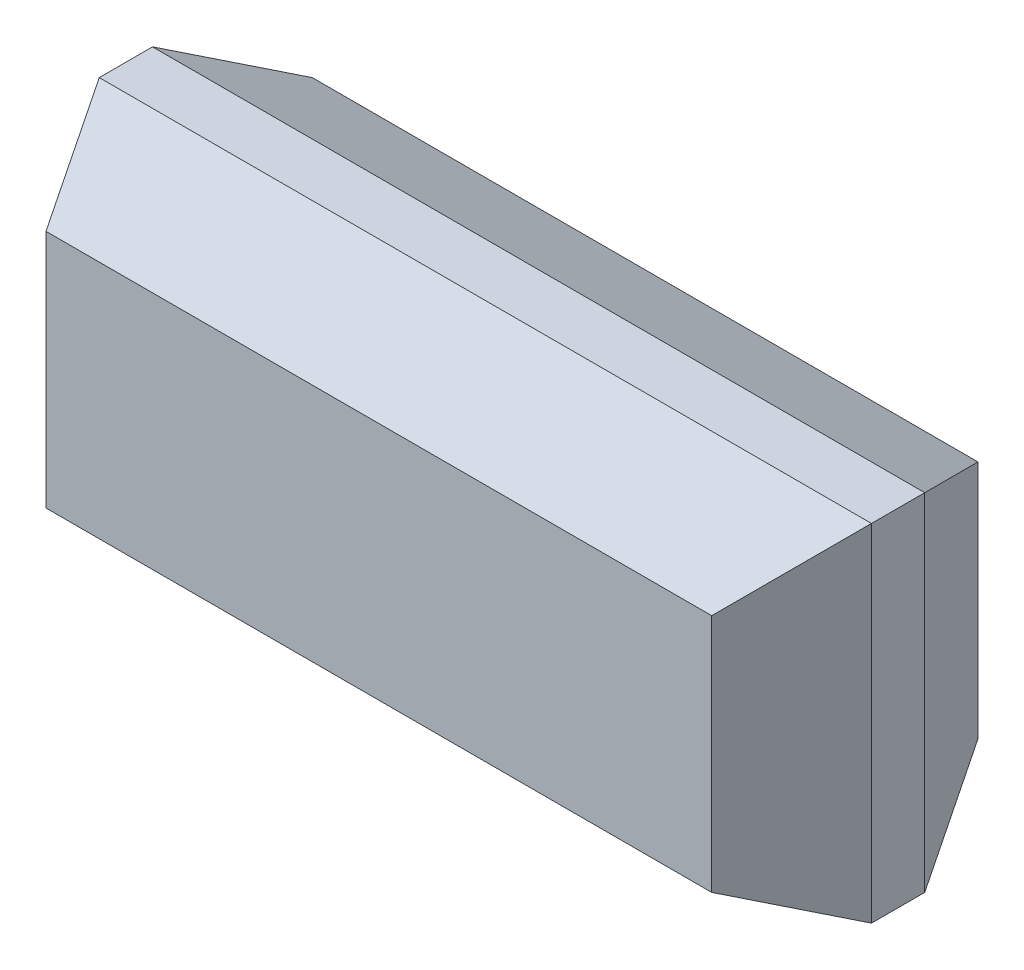
ISO-10303-21;
HEADER;
FILE_DESCRIPTION(('STEP AP214'),'2;1');
FILE_NAME('part.step','',(''),(''),'','','');
FILE_SCHEMA(('AUTOMOTIVE_DESIGN { 1 0 10303 214 1 1 1 1 }'));
ENDSEC;
DATA;
#1=APPLICATION_CONTEXT('core data for automotive mechanical design processes');
#2=APPLICATION_PROTOCOL_DEFINITION('international standard','automotive_design',2000,#1);
#3=PRODUCT_CONTEXT('',#1,'mechanical');
#4=PRODUCT('Part','Part','',(#3));
#5=PRODUCT_RELATED_PRODUCT_CATEGORY('part','',(#4));
#6=PRODUCT_DEFINITION_FORMATION('','',#4);
#7=PRODUCT_DEFINITION_CONTEXT('part definition',#1,'design');
#8=PRODUCT_DEFINITION('design','',#6,#7);
#9=PRODUCT_DEFINITION_SHAPE('','',#8);
#10=(LENGTH_UNIT() NAMED_UNIT(*) SI_UNIT(.MILLI.,.METRE.));
#11=(NAMED_UNIT(*) PLANE_ANGLE_UNIT() SI_UNIT($,.RADIAN.));
#12=(NAMED_UNIT(*) SI_UNIT($,.STERADIAN.) SOLID_ANGLE_UNIT());
#13=UNCERTAINTY_MEASURE_WITH_UNIT(LENGTH_MEASURE(1.E-05),#10,'distance_accuracy_value','');
#14=(GEOMETRIC_REPRESENTATION_CONTEXT(3) GLOBAL_UNCERTAINTY_ASSIGNED_CONTEXT((#13)) GLOBAL_UNIT_ASSIGNED_CONTEXT((#10,
#11,#12)) REPRESENTATION_CONTEXT('',''));
#15=CARTESIAN_POINT('',(0.,0.,0.));
#16=DIRECTION('',(0.,0.,1.));
#17=DIRECTION('',(1.,0.,0.));
#18=AXIS2_PLACEMENT_3D('',#15,#16,#17);
#19=CARTESIAN_POINT('',(0.,0.,1.));
#20=DIRECTION('',(0.,0.,1.));
#21=DIRECTION('',(1.,0.,0.));
#22=AXIS2_PLACEMENT_3D('',#19,#20,#21);
#23=PLANE('',#22);
#24=DIRECTION('',(1.,0.,0.));
#25=VECTOR('',#24,1.);
#26=CARTESIAN_POINT('',(1.45,-0.45,1.));
#27=LINE('',#26,#25);
#28=CARTESIAN_POINT('',(1.25,-0.45,1.));
#29=VERTEX_POINT('',#28);
#30=CARTESIAN_POINT('',(-1.25,-0.45,1.));
#31=VERTEX_POINT('',#30);
#32=EDGE_CURVE('E79',#29,#31,#27,.F.);
#33=ORIENTED_EDGE('',*,*,#32,.F.);
#34=DIRECTION('',(0.,1.,0.));
#35=VECTOR('',#34,1.);
#36=CARTESIAN_POINT('',(1.25,0.,1.));
#37=LINE('',#36,#35);
#38=CARTESIAN_POINT('',(1.25,0.45,1.));
#39=VERTEX_POINT('',#38);
#40=EDGE_CURVE('E20',#29,#39,#37,.T.);
#41=ORIENTED_EDGE('',*,*,#40,.T.);
#42=DIRECTION('',(1.,0.,0.));
#43=VECTOR('',#42,1.);
#44=CARTESIAN_POINT('',(-1.45,0.45,1.));
#45=LINE('',#44,#43);
#46=CARTESIAN_POINT('',(-1.25,0.45,1.));
#47=VERTEX_POINT('',#46);
#48=EDGE_CURVE('E93',#47,#39,#45,.T.);
#49=ORIENTED_EDGE('',*,*,#48,.F.);
#50=DIRECTION('',(0.,1.,0.));
#51=VECTOR('',#50,1.);
#52=CARTESIAN_POINT('',(-1.25,-0.65,1.));
#53=LINE('',#52,#51);
#54=EDGE_CURVE('E84',#31,#47,#53,.T.);
#55=ORIENTED_EDGE('',*,*,#54,.F.);
#56=EDGE_LOOP('',(#33,#41,#49,#55));
#57=FACE_BOUND('',#56,.T.);
#58=ADVANCED_FACE('F17',(#57),#23,.T.);
#59=CARTESIAN_POINT('',(-1.45,0.55,0.8));
#60=DIRECTION('',(0.,0.894427190999916,0.447213595499958));
#61=DIRECTION('',(0.,-0.447213595499958,0.894427190999916));
#62=AXIS2_PLACEMENT_3D('',#59,#60,#61);
#63=PLANE('',#62);
#64=DIRECTION('',(1.,0.,0.));
#65=VECTOR('',#64,1.);
#66=CARTESIAN_POINT('',(-1.45,0.65,0.6));
#67=LINE('',#66,#65);
#68=CARTESIAN_POINT('',(-1.45,0.65,0.6));
#69=VERTEX_POINT('',#68);
#70=CARTESIAN_POINT('',(1.45,0.65,0.6));
#71=VERTEX_POINT('',#70);
#72=EDGE_CURVE('E101',#69,#71,#67,.T.);
#73=ORIENTED_EDGE('',*,*,#72,.F.);
#74=DIRECTION('',(-0.408248290463863,0.408248290463863,-0.816496580927726));
#75=VECTOR('',#74,1.);
#76=CARTESIAN_POINT('',(-1.25,0.45,1.));
#77=LINE('',#76,#75);
#78=EDGE_CURVE('E89',#47,#69,#77,.T.);
#79=ORIENTED_EDGE('',*,*,#78,.F.);
#80=ORIENTED_EDGE('',*,*,#48,.T.);
#81=DIRECTION('',(-0.408248290463863,-0.408248290463863,0.816496580927726));
#82=VECTOR('',#81,1.);
#83=CARTESIAN_POINT('',(1.45,0.65,0.6));
#84=LINE('',#83,#82);
#85=EDGE_CURVE('E109',#71,#39,#84,.T.);
#86=ORIENTED_EDGE('',*,*,#85,.F.);
#87=EDGE_LOOP('',(#73,#79,#80,#86));
#88=FACE_BOUND('',#87,.T.);
#89=ADVANCED_FACE('F100',(#88),#63,.T.);
#90=CARTESIAN_POINT('',(-1.35,-0.65,0.8));
#91=DIRECTION('',(-0.894427190999916,0.,0.447213595499958));
#92=DIRECTION('',(0.447213595499958,0.,0.894427190999916));
#93=AXIS2_PLACEMENT_3D('',#90,#91,#92);
#94=PLANE('',#93);
#95=DIRECTION('',(0.,1.,0.));
#96=VECTOR('',#95,1.);
#97=CARTESIAN_POINT('',(-1.45,-0.65,0.6));
#98=LINE('',#97,#96);
#99=CARTESIAN_POINT('',(-1.45,-0.65,0.6));
#100=VERTEX_POINT('',#99);
#101=EDGE_CURVE('E112',#100,#69,#98,.T.);
#102=ORIENTED_EDGE('',*,*,#101,.F.);
#103=DIRECTION('',(-0.408248290463862,-0.408248290463863,-0.816496580927726));
#104=VECTOR('',#103,1.);
#105=CARTESIAN_POINT('',(-1.25,-0.45,1.));
#106=LINE('',#105,#104);
#107=EDGE_CURVE('E91',#31,#100,#106,.T.);
#108=ORIENTED_EDGE('',*,*,#107,.F.);
#109=ORIENTED_EDGE('',*,*,#54,.T.);
#110=ORIENTED_EDGE('',*,*,#78,.T.);
#111=EDGE_LOOP('',(#102,#108,#109,#110));
#112=FACE_BOUND('',#111,.T.);
#113=ADVANCED_FACE('F87',(#112),#94,.T.);
#114=CARTESIAN_POINT('',(1.45,-0.55,0.8));
#115=DIRECTION('',(0.,-0.894427190999916,0.447213595499958));
#116=DIRECTION('',(0.,-0.447213595499958,-0.894427190999916));
#117=AXIS2_PLACEMENT_3D('',#114,#115,#116);
#118=PLANE('',#117);
#119=DIRECTION('',(1.,0.,0.));
#120=VECTOR('',#119,1.);
#121=CARTESIAN_POINT('',(1.45,-0.65,0.6));
#122=LINE('',#121,#120);
#123=CARTESIAN_POINT('',(1.45,-0.65,0.6));
#124=VERTEX_POINT('',#123);
#125=EDGE_CURVE('E116',#124,#100,#122,.F.);
#126=ORIENTED_EDGE('',*,*,#125,.F.);
#127=DIRECTION('',(0.408248290463863,-0.408248290463863,-0.816496580927726));
#128=VECTOR('',#127,1.);
#129=CARTESIAN_POINT('',(1.25,-0.45,1.));
#130=LINE('',#129,#128);
#131=EDGE_CURVE('E107',#29,#124,#130,.T.);
#132=ORIENTED_EDGE('',*,*,#131,.F.);
#133=ORIENTED_EDGE('',*,*,#32,.T.);
#134=ORIENTED_EDGE('',*,*,#107,.T.);
#135=EDGE_LOOP('',(#126,#132,#133,#134));
#136=FACE_BOUND('',#135,.T.);
#137=ADVANCED_FACE('F206',(#136),#118,.T.);
#138=CARTESIAN_POINT('',(1.35,0.65,0.8));
#139=DIRECTION('',(0.894427190999916,0.,0.447213595499958));
#140=DIRECTION('',(0.447213595499958,0.,-0.894427190999916));
#141=AXIS2_PLACEMENT_3D('',#138,#139,#140);
#142=PLANE('',#141);
#143=DIRECTION('',(0.,1.,0.));
#144=VECTOR('',#143,1.);
#145=CARTESIAN_POINT('',(1.45,0.65,0.6));
#146=LINE('',#145,#144);
#147=EDGE_CURVE('E124',#71,#124,#146,.F.);
#148=ORIENTED_EDGE('',*,*,#147,.F.);
#149=ORIENTED_EDGE('',*,*,#85,.T.);
#150=ORIENTED_EDGE('',*,*,#40,.F.);
#151=ORIENTED_EDGE('',*,*,#131,.T.);
#152=EDGE_LOOP('',(#148,#149,#150,#151));
#153=FACE_BOUND('',#152,.T.);
#154=ADVANCED_FACE('F202',(#153),#142,.T.);
#155=CARTESIAN_POINT('',(-1.45,0.65,0.));
#156=DIRECTION('',(0.,1.,0.));
#157=DIRECTION('',(0.,0.,1.));
#158=AXIS2_PLACEMENT_3D('',#155,#156,#157);
#159=PLANE('',#158);
#160=DIRECTION('',(0.,0.,-1.));
#161=VECTOR('',#160,1.);
#162=CARTESIAN_POINT('',(1.45,0.65,0.));
#163=LINE('',#162,#161);
#164=CARTESIAN_POINT('',(1.45,0.65,0.4));
#165=VERTEX_POINT('',#164);
#166=EDGE_CURVE('E121',#165,#71,#163,.F.);
#167=ORIENTED_EDGE('',*,*,#166,.F.);
#168=DIRECTION('',(1.,0.,0.));
#169=VECTOR('',#168,1.);
#170=CARTESIAN_POINT('',(-1.45,0.65,0.4));
#171=LINE('',#170,#169);
#172=CARTESIAN_POINT('',(-1.45,0.65,0.4));
#173=VERTEX_POINT('',#172);
#174=EDGE_CURVE('E129',#165,#173,#171,.F.);
#175=ORIENTED_EDGE('',*,*,#174,.T.);
#176=DIRECTION('',(0.,0.,1.));
#177=VECTOR('',#176,1.);
#178=CARTESIAN_POINT('',(-1.45,0.65,0.));
#179=LINE('',#178,#177);
#180=EDGE_CURVE('E114',#69,#173,#179,.F.);
#181=ORIENTED_EDGE('',*,*,#180,.F.);
#182=ORIENTED_EDGE('',*,*,#72,.T.);
#183=EDGE_LOOP('',(#167,#175,#181,#182));
#184=FACE_BOUND('',#183,.T.);
#185=ADVANCED_FACE('F198',(#184),#159,.T.);
#186=CARTESIAN_POINT('',(-1.45,-0.65,0.));
#187=DIRECTION('',(-1.,0.,0.));
#188=DIRECTION('',(0.,0.,1.));
#189=AXIS2_PLACEMENT_3D('',#186,#187,#188);
#190=PLANE('',#189);
#191=ORIENTED_EDGE('',*,*,#180,.T.);
#192=DIRECTION('',(0.,1.,0.));
#193=VECTOR('',#192,1.);
#194=CARTESIAN_POINT('',(-1.45,-0.65,0.4));
#195=LINE('',#194,#193);
#196=CARTESIAN_POINT('',(-1.45,-0.65,0.4));
#197=VERTEX_POINT('',#196);
#198=EDGE_CURVE('E135',#173,#197,#195,.F.);
#199=ORIENTED_EDGE('',*,*,#198,.T.);
#200=DIRECTION('',(0.,0.,-1.));
#201=VECTOR('',#200,1.);
#202=CARTESIAN_POINT('',(-1.45,-0.65,0.));
#203=LINE('',#202,#201);
#204=EDGE_CURVE('E119',#100,#197,#203,.T.);
#205=ORIENTED_EDGE('',*,*,#204,.F.);
#206=ORIENTED_EDGE('',*,*,#101,.T.);
#207=EDGE_LOOP('',(#191,#199,#205,#206));
#208=FACE_BOUND('',#207,.T.);
#209=ADVANCED_FACE('F194',(#208),#190,.T.);
#210=CARTESIAN_POINT('',(1.45,-0.65,0.));
#211=DIRECTION('',(0.,-1.,0.));
#212=DIRECTION('',(0.,0.,-1.));
#213=AXIS2_PLACEMENT_3D('',#210,#211,#212);
#214=PLANE('',#213);
#215=ORIENTED_EDGE('',*,*,#204,.T.);
#216=DIRECTION('',(1.,0.,0.));
#217=VECTOR('',#216,1.);
#218=CARTESIAN_POINT('',(1.45,-0.65,0.4));
#219=LINE('',#218,#217);
#220=CARTESIAN_POINT('',(1.45,-0.65,0.4));
#221=VERTEX_POINT('',#220);
#222=EDGE_CURVE('E141',#197,#221,#219,.T.);
#223=ORIENTED_EDGE('',*,*,#222,.T.);
#224=DIRECTION('',(0.,0.,-1.));
#225=VECTOR('',#224,1.);
#226=CARTESIAN_POINT('',(1.45,-0.65,0.));
#227=LINE('',#226,#225);
#228=EDGE_CURVE('E127',#124,#221,#227,.T.);
#229=ORIENTED_EDGE('',*,*,#228,.F.);
#230=ORIENTED_EDGE('',*,*,#125,.T.);
#231=EDGE_LOOP('',(#215,#223,#229,#230));
#232=FACE_BOUND('',#231,.T.);
#233=ADVANCED_FACE('F190',(#232),#214,.T.);
#234=CARTESIAN_POINT('',(1.45,0.65,0.));
#235=DIRECTION('',(1.,0.,0.));
#236=DIRECTION('',(0.,0.,-1.));
#237=AXIS2_PLACEMENT_3D('',#234,#235,#236);
#238=PLANE('',#237);
#239=ORIENTED_EDGE('',*,*,#228,.T.);
#240=DIRECTION('',(0.,1.,0.));
#241=VECTOR('',#240,1.);
#242=CARTESIAN_POINT('',(1.45,0.65,0.4));
#243=LINE('',#242,#241);
#244=EDGE_CURVE('E145',#221,#165,#243,.T.);
#245=ORIENTED_EDGE('',*,*,#244,.T.);
#246=ORIENTED_EDGE('',*,*,#166,.T.);
#247=ORIENTED_EDGE('',*,*,#147,.T.);
#248=EDGE_LOOP('',(#239,#245,#246,#247));
#249=FACE_BOUND('',#248,.T.);
#250=ADVANCED_FACE('F187',(#249),#238,.T.);
#251=CARTESIAN_POINT('',(-1.45,0.55,0.2));
#252=DIRECTION('',(0.,-0.894427190999916,0.447213595499958));
#253=DIRECTION('',(0.,-0.447213595499958,-0.894427190999916));
#254=AXIS2_PLACEMENT_3D('',#251,#252,#253);
#255=PLANE('',#254);
#256=ORIENTED_EDGE('',*,*,#174,.F.);
#257=DIRECTION('',(-0.408248290463863,-0.408248290463863,-0.816496580927726));
#258=VECTOR('',#257,1.);
#259=CARTESIAN_POINT('',(1.45,0.65,0.4));
#260=LINE('',#259,#258);
#261=CARTESIAN_POINT('',(1.25,0.45,0.));
#262=VERTEX_POINT('',#261);
#263=EDGE_CURVE('E148',#165,#262,#260,.T.);
#264=ORIENTED_EDGE('',*,*,#263,.T.);
#265=DIRECTION('',(1.,0.,0.));
#266=VECTOR('',#265,1.);
#267=CARTESIAN_POINT('',(0.,0.45,0.));
#268=LINE('',#267,#266);
#269=CARTESIAN_POINT('',(-1.25,0.45,0.));
#270=VERTEX_POINT('',#269);
#271=EDGE_CURVE('E151',#262,#270,#268,.F.);
#272=ORIENTED_EDGE('',*,*,#271,.T.);
#273=DIRECTION('',(-0.408248290463863,0.408248290463863,0.816496580927726));
#274=VECTOR('',#273,1.);
#275=CARTESIAN_POINT('',(-1.25,0.45,0.));
#276=LINE('',#275,#274);
#277=EDGE_CURVE('E132',#270,#173,#276,.T.);
#278=ORIENTED_EDGE('',*,*,#277,.T.);
#279=EDGE_LOOP('',(#256,#264,#272,#278));
#280=FACE_BOUND('',#279,.T.);
#281=ADVANCED_FACE('F169',(#280),#255,.F.);
#282=CARTESIAN_POINT('',(-1.35,-0.65,0.2));
#283=DIRECTION('',(0.894427190999916,0.,0.447213595499958));
#284=DIRECTION('',(0.447213595499958,0.,-0.894427190999916));
#285=AXIS2_PLACEMENT_3D('',#282,#283,#284);
#286=PLANE('',#285);
#287=ORIENTED_EDGE('',*,*,#198,.F.);
#288=ORIENTED_EDGE('',*,*,#277,.F.);
#289=DIRECTION('',(0.,1.,0.));
#290=VECTOR('',#289,1.);
#291=CARTESIAN_POINT('',(-1.25,0.,0.));
#292=LINE('',#291,#290);
#293=CARTESIAN_POINT('',(-1.25,-0.45,0.));
#294=VERTEX_POINT('',#293);
#295=EDGE_CURVE('E154',#270,#294,#292,.F.);
#296=ORIENTED_EDGE('',*,*,#295,.T.);
#297=DIRECTION('',(-0.408248290463862,-0.408248290463863,0.816496580927726));
#298=VECTOR('',#297,1.);
#299=CARTESIAN_POINT('',(-1.25,-0.45,0.));
#300=LINE('',#299,#298);
#301=EDGE_CURVE('E138',#294,#197,#300,.T.);
#302=ORIENTED_EDGE('',*,*,#301,.T.);
#303=EDGE_LOOP('',(#287,#288,#296,#302));
#304=FACE_BOUND('',#303,.T.);
#305=ADVANCED_FACE('F167',(#304),#286,.F.);
#306=CARTESIAN_POINT('',(1.45,-0.55,0.2));
#307=DIRECTION('',(0.,0.894427190999916,0.447213595499958));
#308=DIRECTION('',(0.,-0.447213595499958,0.894427190999916));
#309=AXIS2_PLACEMENT_3D('',#306,#307,#308);
#310=PLANE('',#309);
#311=ORIENTED_EDGE('',*,*,#222,.F.);
#312=ORIENTED_EDGE('',*,*,#301,.F.);
#313=DIRECTION('',(1.,0.,0.));
#314=VECTOR('',#313,1.);
#315=CARTESIAN_POINT('',(0.,-0.45,0.));
#316=LINE('',#315,#314);
#317=CARTESIAN_POINT('',(1.25,-0.45,0.));
#318=VERTEX_POINT('',#317);
#319=EDGE_CURVE('E26',#294,#318,#316,.T.);
#320=ORIENTED_EDGE('',*,*,#319,.T.);
#321=DIRECTION('',(0.408248290463863,-0.408248290463863,0.816496580927726));
#322=VECTOR('',#321,1.);
#323=CARTESIAN_POINT('',(1.25,-0.45,0.));
#324=LINE('',#323,#322);
#325=EDGE_CURVE('E34',#318,#221,#324,.T.);
#326=ORIENTED_EDGE('',*,*,#325,.T.);
#327=EDGE_LOOP('',(#311,#312,#320,#326));
#328=FACE_BOUND('',#327,.T.);
#329=ADVANCED_FACE('F161',(#328),#310,.F.);
#330=CARTESIAN_POINT('',(1.35,0.65,0.2));
#331=DIRECTION('',(-0.894427190999916,0.,0.447213595499958));
#332=DIRECTION('',(0.447213595499958,0.,0.894427190999916));
#333=AXIS2_PLACEMENT_3D('',#330,#331,#332);
#334=PLANE('',#333);
#335=ORIENTED_EDGE('',*,*,#244,.F.);
#336=ORIENTED_EDGE('',*,*,#325,.F.);
#337=DIRECTION('',(0.,1.,0.));
#338=VECTOR('',#337,1.);
#339=CARTESIAN_POINT('',(1.25,0.,0.));
#340=LINE('',#339,#338);
#341=EDGE_CURVE('E11',#318,#262,#340,.T.);
#342=ORIENTED_EDGE('',*,*,#341,.T.);
#343=ORIENTED_EDGE('',*,*,#263,.F.);
#344=EDGE_LOOP('',(#335,#336,#342,#343));
#345=FACE_BOUND('',#344,.T.);
#346=ADVANCED_FACE('F172',(#345),#334,.F.);
#347=CARTESIAN_POINT('',(0.,0.,0.));
#348=DIRECTION('',(0.,0.,1.));
#349=DIRECTION('',(1.,0.,0.));
#350=AXIS2_PLACEMENT_3D('',#347,#348,#349);
#351=PLANE('',#350);
#352=ORIENTED_EDGE('',*,*,#319,.F.);
#353=ORIENTED_EDGE('',*,*,#295,.F.);
#354=ORIENTED_EDGE('',*,*,#271,.F.);
#355=ORIENTED_EDGE('',*,*,#341,.F.);
#356=EDGE_LOOP('',(#352,#353,#354,#355));
#357=FACE_BOUND('',#356,.T.);
#358=ADVANCED_FACE('F164',(#357),#351,.F.);
#359=CLOSED_SHELL('',(#58,#89,#113,#137,#154,#185,#209,#233,#250,#281,#305,#329,#346,#358));
#360=MANIFOLD_SOLID_BREP('B1',#359);
#361=ADVANCED_BREP_SHAPE_REPRESENTATION('',(#18,#360),#14);
#362=SHAPE_DEFINITION_REPRESENTATION(#9,#361);
ENDSEC;
END-ISO-10303-21;
